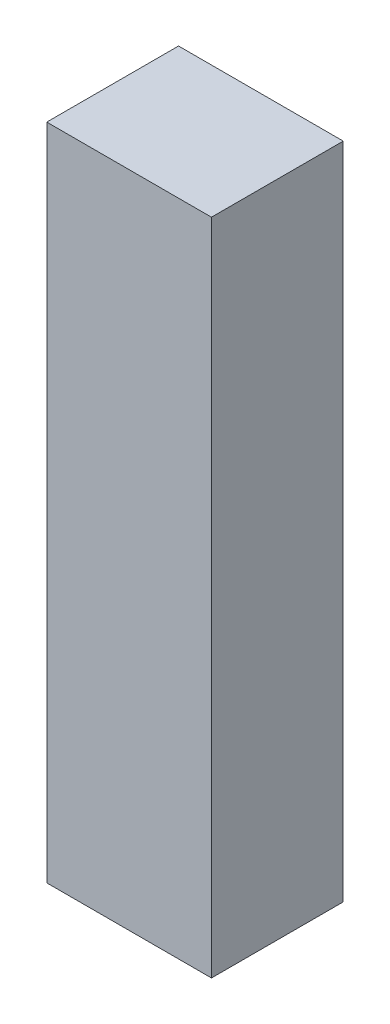
ISO-10303-21;
HEADER;
FILE_DESCRIPTION(('STEP AP214'),'2;1');
FILE_NAME('part.step','',(''),(''),'','','');
FILE_SCHEMA(('AUTOMOTIVE_DESIGN { 1 0 10303 214 1 1 1 1 }'));
ENDSEC;
DATA;
#1=APPLICATION_CONTEXT('core data for automotive mechanical design processes');
#2=APPLICATION_PROTOCOL_DEFINITION('international standard','automotive_design',2000,#1);
#3=PRODUCT_CONTEXT('',#1,'mechanical');
#4=PRODUCT('Part','Part','',(#3));
#5=PRODUCT_RELATED_PRODUCT_CATEGORY('part','',(#4));
#6=PRODUCT_DEFINITION_FORMATION('','',#4);
#7=PRODUCT_DEFINITION_CONTEXT('part definition',#1,'design');
#8=PRODUCT_DEFINITION('design','',#6,#7);
#9=PRODUCT_DEFINITION_SHAPE('','',#8);
#10=(LENGTH_UNIT() NAMED_UNIT(*) SI_UNIT(.MILLI.,.METRE.));
#11=(NAMED_UNIT(*) PLANE_ANGLE_UNIT() SI_UNIT($,.RADIAN.));
#12=(NAMED_UNIT(*) SI_UNIT($,.STERADIAN.) SOLID_ANGLE_UNIT());
#13=UNCERTAINTY_MEASURE_WITH_UNIT(LENGTH_MEASURE(1.E-05),#10,'distance_accuracy_value','');
#14=(GEOMETRIC_REPRESENTATION_CONTEXT(3) GLOBAL_UNCERTAINTY_ASSIGNED_CONTEXT((#13)) GLOBAL_UNIT_ASSIGNED_CONTEXT((#10,
#11,#12)) REPRESENTATION_CONTEXT('',''));
#15=CARTESIAN_POINT('',(0.,0.,0.));
#16=DIRECTION('',(0.,0.,1.));
#17=DIRECTION('',(1.,0.,0.));
#18=AXIS2_PLACEMENT_3D('',#15,#16,#17);
#19=CARTESIAN_POINT('',(360.,330.,-776.));
#20=DIRECTION('',(-1.,0.,0.));
#21=DIRECTION('',(0.,0.,1.));
#22=AXIS2_PLACEMENT_3D('',#19,#20,#21);
#23=PLANE('',#22);
#24=DIRECTION('',(0.,-1.,0.));
#25=VECTOR('',#24,1.);
#26=CARTESIAN_POINT('',(360.,330.,-736.));
#27=LINE('',#26,#25);
#28=CARTESIAN_POINT('',(360.,530.,-736.));
#29=VERTEX_POINT('',#28);
#30=CARTESIAN_POINT('',(360.,330.,-736.));
#31=VERTEX_POINT('',#30);
#32=EDGE_CURVE('E103',#29,#31,#27,.T.);
#33=ORIENTED_EDGE('',*,*,#32,.F.);
#34=DIRECTION('',(0.,0.,1.));
#35=VECTOR('',#34,1.);
#36=CARTESIAN_POINT('',(360.,530.,-776.));
#37=LINE('',#36,#35);
#38=CARTESIAN_POINT('',(360.,530.,-776.));
#39=VERTEX_POINT('',#38);
#40=EDGE_CURVE('E11',#39,#29,#37,.T.);
#41=ORIENTED_EDGE('',*,*,#40,.F.);
#42=DIRECTION('',(0.,-1.,0.));
#43=VECTOR('',#42,1.);
#44=CARTESIAN_POINT('',(360.,330.,-776.));
#45=LINE('',#44,#43);
#46=CARTESIAN_POINT('',(360.,330.,-776.));
#47=VERTEX_POINT('',#46);
#48=EDGE_CURVE('E97',#39,#47,#45,.T.);
#49=ORIENTED_EDGE('',*,*,#48,.T.);
#50=DIRECTION('',(0.,0.,1.));
#51=VECTOR('',#50,1.);
#52=CARTESIAN_POINT('',(360.,330.,-776.));
#53=LINE('',#52,#51);
#54=EDGE_CURVE('E42',#47,#31,#53,.T.);
#55=ORIENTED_EDGE('',*,*,#54,.T.);
#56=EDGE_LOOP('',(#33,#41,#49,#55));
#57=FACE_BOUND('',#56,.T.);
#58=ADVANCED_FACE('F39',(#57),#23,.T.);
#59=CARTESIAN_POINT('',(360.,530.,-776.));
#60=DIRECTION('',(0.,1.,0.));
#61=DIRECTION('',(0.,0.,1.));
#62=AXIS2_PLACEMENT_3D('',#59,#60,#61);
#63=PLANE('',#62);
#64=DIRECTION('',(-1.,0.,0.));
#65=VECTOR('',#64,1.);
#66=CARTESIAN_POINT('',(360.,530.,-736.));
#67=LINE('',#66,#65);
#68=CARTESIAN_POINT('',(410.,530.,-736.));
#69=VERTEX_POINT('',#68);
#70=EDGE_CURVE('E99',#69,#29,#67,.T.);
#71=ORIENTED_EDGE('',*,*,#70,.F.);
#72=DIRECTION('',(0.,0.,1.));
#73=VECTOR('',#72,1.);
#74=CARTESIAN_POINT('',(410.,530.,-776.));
#75=LINE('',#74,#73);
#76=CARTESIAN_POINT('',(410.,530.,-776.));
#77=VERTEX_POINT('',#76);
#78=EDGE_CURVE('E48',#77,#69,#75,.T.);
#79=ORIENTED_EDGE('',*,*,#78,.F.);
#80=DIRECTION('',(-1.,0.,0.));
#81=VECTOR('',#80,1.);
#82=CARTESIAN_POINT('',(360.,530.,-776.));
#83=LINE('',#82,#81);
#84=EDGE_CURVE('E94',#77,#39,#83,.T.);
#85=ORIENTED_EDGE('',*,*,#84,.T.);
#86=ORIENTED_EDGE('',*,*,#40,.T.);
#87=EDGE_LOOP('',(#71,#79,#85,#86));
#88=FACE_BOUND('',#87,.T.);
#89=ADVANCED_FACE('F113',(#88),#63,.T.);
#90=CARTESIAN_POINT('',(410.,330.,-776.));
#91=DIRECTION('',(1.,0.,0.));
#92=DIRECTION('',(0.,0.,-1.));
#93=AXIS2_PLACEMENT_3D('',#90,#91,#92);
#94=PLANE('',#93);
#95=DIRECTION('',(0.,1.,0.));
#96=VECTOR('',#95,1.);
#97=CARTESIAN_POINT('',(410.,330.,-736.));
#98=LINE('',#97,#96);
#99=CARTESIAN_POINT('',(410.,330.,-736.));
#100=VERTEX_POINT('',#99);
#101=EDGE_CURVE('E89',#100,#69,#98,.T.);
#102=ORIENTED_EDGE('',*,*,#101,.F.);
#103=DIRECTION('',(0.,0.,1.));
#104=VECTOR('',#103,1.);
#105=CARTESIAN_POINT('',(410.,330.,-776.));
#106=LINE('',#105,#104);
#107=CARTESIAN_POINT('',(410.,330.,-776.));
#108=VERTEX_POINT('',#107);
#109=EDGE_CURVE('E84',#108,#100,#106,.T.);
#110=ORIENTED_EDGE('',*,*,#109,.F.);
#111=DIRECTION('',(0.,1.,0.));
#112=VECTOR('',#111,1.);
#113=CARTESIAN_POINT('',(410.,330.,-776.));
#114=LINE('',#113,#112);
#115=EDGE_CURVE('E87',#108,#77,#114,.T.);
#116=ORIENTED_EDGE('',*,*,#115,.T.);
#117=ORIENTED_EDGE('',*,*,#78,.T.);
#118=EDGE_LOOP('',(#102,#110,#116,#117));
#119=FACE_BOUND('',#118,.T.);
#120=ADVANCED_FACE('F86',(#119),#94,.T.);
#121=CARTESIAN_POINT('',(360.,330.,-776.));
#122=DIRECTION('',(0.,-1.,0.));
#123=DIRECTION('',(0.,0.,-1.));
#124=AXIS2_PLACEMENT_3D('',#121,#122,#123);
#125=PLANE('',#124);
#126=DIRECTION('',(1.,0.,0.));
#127=VECTOR('',#126,1.);
#128=CARTESIAN_POINT('',(360.,330.,-736.));
#129=LINE('',#128,#127);
#130=EDGE_CURVE('E106',#31,#100,#129,.T.);
#131=ORIENTED_EDGE('',*,*,#130,.F.);
#132=ORIENTED_EDGE('',*,*,#54,.F.);
#133=DIRECTION('',(1.,0.,0.));
#134=VECTOR('',#133,1.);
#135=CARTESIAN_POINT('',(360.,330.,-776.));
#136=LINE('',#135,#134);
#137=EDGE_CURVE('E93',#47,#108,#136,.T.);
#138=ORIENTED_EDGE('',*,*,#137,.T.);
#139=ORIENTED_EDGE('',*,*,#109,.T.);
#140=EDGE_LOOP('',(#131,#132,#138,#139));
#141=FACE_BOUND('',#140,.T.);
#142=ADVANCED_FACE('F96',(#141),#125,.T.);
#143=CARTESIAN_POINT('',(0.,0.,-776.));
#144=DIRECTION('',(0.,0.,-1.));
#145=DIRECTION('',(-1.,0.,0.));
#146=AXIS2_PLACEMENT_3D('',#143,#144,#145);
#147=PLANE('',#146);
#148=ORIENTED_EDGE('',*,*,#48,.F.);
#149=ORIENTED_EDGE('',*,*,#84,.F.);
#150=ORIENTED_EDGE('',*,*,#115,.F.);
#151=ORIENTED_EDGE('',*,*,#137,.F.);
#152=EDGE_LOOP('',(#148,#149,#150,#151));
#153=FACE_BOUND('',#152,.T.);
#154=ADVANCED_FACE('F92',(#153),#147,.T.);
#155=CARTESIAN_POINT('',(0.,0.,-736.));
#156=DIRECTION('',(0.,0.,-1.));
#157=DIRECTION('',(-1.,0.,0.));
#158=AXIS2_PLACEMENT_3D('',#155,#156,#157);
#159=PLANE('',#158);
#160=ORIENTED_EDGE('',*,*,#32,.T.);
#161=ORIENTED_EDGE('',*,*,#130,.T.);
#162=ORIENTED_EDGE('',*,*,#101,.T.);
#163=ORIENTED_EDGE('',*,*,#70,.T.);
#164=EDGE_LOOP('',(#160,#161,#162,#163));
#165=FACE_BOUND('',#164,.T.);
#166=ADVANCED_FACE('F112',(#165),#159,.F.);
#167=CLOSED_SHELL('',(#58,#89,#120,#142,#154,#166));
#168=MANIFOLD_SOLID_BREP('B2',#167);
#169=ADVANCED_BREP_SHAPE_REPRESENTATION('',(#18,#168),#14);
#170=SHAPE_DEFINITION_REPRESENTATION(#9,#169);
ENDSEC;
END-ISO-10303-21;
